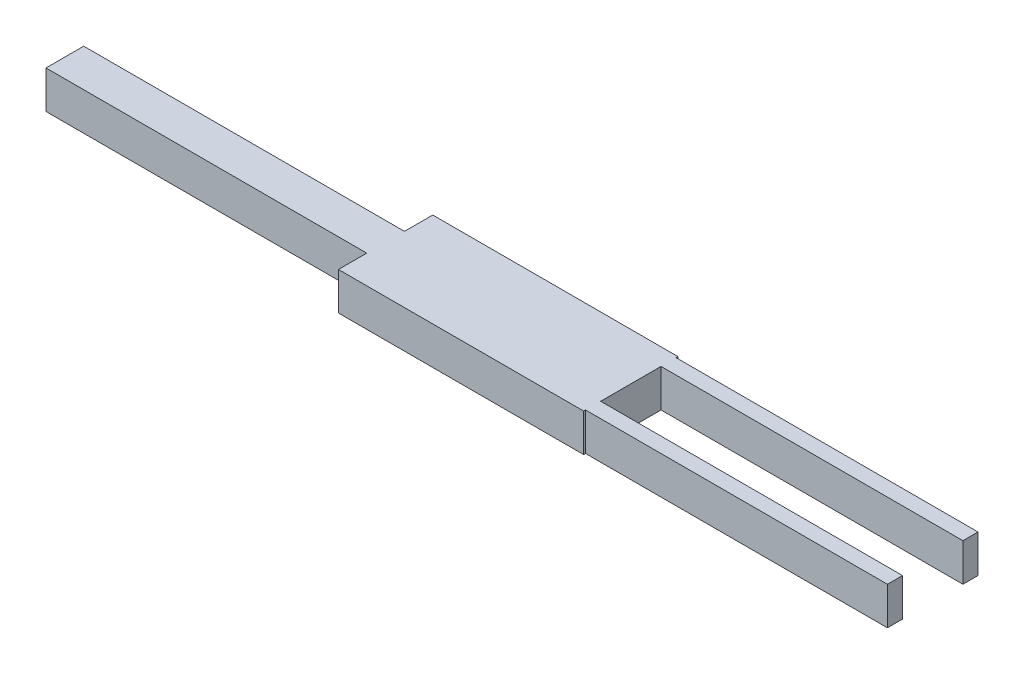
ISO-10303-21;
HEADER;
FILE_DESCRIPTION(('STEP AP214'),'2;1');
FILE_NAME('part.step','',(''),(''),'','','');
FILE_SCHEMA(('AUTOMOTIVE_DESIGN { 1 0 10303 214 1 1 1 1 }'));
ENDSEC;
DATA;
#1=APPLICATION_CONTEXT('core data for automotive mechanical design processes');
#2=APPLICATION_PROTOCOL_DEFINITION('international standard','automotive_design',2000,#1);
#3=PRODUCT_CONTEXT('',#1,'mechanical');
#4=PRODUCT('Part','Part','',(#3));
#5=PRODUCT_RELATED_PRODUCT_CATEGORY('part','',(#4));
#6=PRODUCT_DEFINITION_FORMATION('','',#4);
#7=PRODUCT_DEFINITION_CONTEXT('part definition',#1,'design');
#8=PRODUCT_DEFINITION('design','',#6,#7);
#9=PRODUCT_DEFINITION_SHAPE('','',#8);
#10=(LENGTH_UNIT() NAMED_UNIT(*) SI_UNIT(.MILLI.,.METRE.));
#11=(NAMED_UNIT(*) PLANE_ANGLE_UNIT() SI_UNIT($,.RADIAN.));
#12=(NAMED_UNIT(*) SI_UNIT($,.STERADIAN.) SOLID_ANGLE_UNIT());
#13=UNCERTAINTY_MEASURE_WITH_UNIT(LENGTH_MEASURE(1.E-05),#10,'distance_accuracy_value','');
#14=(GEOMETRIC_REPRESENTATION_CONTEXT(3) GLOBAL_UNCERTAINTY_ASSIGNED_CONTEXT((#13)) GLOBAL_UNIT_ASSIGNED_CONTEXT((#10,
#11,#12)) REPRESENTATION_CONTEXT('',''));
#15=CARTESIAN_POINT('',(0.,0.,0.));
#16=DIRECTION('',(0.,0.,1.));
#17=DIRECTION('',(1.,0.,0.));
#18=AXIS2_PLACEMENT_3D('',#15,#16,#17);
#19=CARTESIAN_POINT('',(251.197875897678,10.,-10.1864142560755));
#20=DIRECTION('',(-1.,0.,0.));
#21=DIRECTION('',(0.,0.,1.));
#22=AXIS2_PLACEMENT_3D('',#19,#20,#21);
#23=PLANE('',#22);
#24=DIRECTION('',(0.,0.,-1.));
#25=VECTOR('',#24,1.);
#26=CARTESIAN_POINT('',(251.197875897678,0.,-10.1864142560755));
#27=LINE('',#26,#25);
#28=CARTESIAN_POINT('',(251.197875897678,0.,-10.1864142560755));
#29=VERTEX_POINT('',#28);
#30=CARTESIAN_POINT('',(251.197875897678,0.,-14.1864142560755));
#31=VERTEX_POINT('',#30);
#32=EDGE_CURVE('E177',#29,#31,#27,.T.);
#33=ORIENTED_EDGE('',*,*,#32,.T.);
#34=DIRECTION('',(0.,-1.,0.));
#35=VECTOR('',#34,1.);
#36=CARTESIAN_POINT('',(251.197875897678,10.,-14.1864142560755));
#37=LINE('',#36,#35);
#38=CARTESIAN_POINT('',(251.197875897678,10.,-14.1864142560755));
#39=VERTEX_POINT('',#38);
#40=EDGE_CURVE('E11',#39,#31,#37,.T.);
#41=ORIENTED_EDGE('',*,*,#40,.F.);
#42=DIRECTION('',(0.,0.,-1.));
#43=VECTOR('',#42,1.);
#44=CARTESIAN_POINT('',(251.197875897678,10.,-10.1864142560755));
#45=LINE('',#44,#43);
#46=CARTESIAN_POINT('',(251.197875897678,10.,-10.1864142560755));
#47=VERTEX_POINT('',#46);
#48=EDGE_CURVE('E207',#47,#39,#45,.T.);
#49=ORIENTED_EDGE('',*,*,#48,.F.);
#50=DIRECTION('',(0.,-1.,0.));
#51=VECTOR('',#50,1.);
#52=CARTESIAN_POINT('',(251.197875897678,10.,-10.1864142560755));
#53=LINE('',#52,#51);
#54=EDGE_CURVE('E173',#47,#29,#53,.T.);
#55=ORIENTED_EDGE('',*,*,#54,.T.);
#56=EDGE_LOOP('',(#33,#41,#49,#55));
#57=FACE_BOUND('',#56,.T.);
#58=ADVANCED_FACE('F33',(#57),#23,.F.);
#59=CARTESIAN_POINT('',(251.197875897678,10.,-14.1864142560755));
#60=DIRECTION('',(0.,0.,1.));
#61=DIRECTION('',(1.,0.,0.));
#62=AXIS2_PLACEMENT_3D('',#59,#60,#61);
#63=PLANE('',#62);
#64=DIRECTION('',(-1.,0.,0.));
#65=VECTOR('',#64,1.);
#66=CARTESIAN_POINT('',(251.197875897678,0.,-14.1864142560755));
#67=LINE('',#66,#65);
#68=CARTESIAN_POINT('',(171.197875897678,0.,-14.1864142560755));
#69=VERTEX_POINT('',#68);
#70=EDGE_CURVE('E180',#31,#69,#67,.T.);
#71=ORIENTED_EDGE('',*,*,#70,.T.);
#72=DIRECTION('',(0.,-1.,0.));
#73=VECTOR('',#72,1.);
#74=CARTESIAN_POINT('',(171.197875897678,10.,-14.1864142560755));
#75=LINE('',#74,#73);
#76=CARTESIAN_POINT('',(171.197875897678,10.,-14.1864142560755));
#77=VERTEX_POINT('',#76);
#78=EDGE_CURVE('E41',#77,#69,#75,.T.);
#79=ORIENTED_EDGE('',*,*,#78,.F.);
#80=DIRECTION('',(-1.,0.,0.));
#81=VECTOR('',#80,1.);
#82=CARTESIAN_POINT('',(251.197875897678,10.,-14.1864142560755));
#83=LINE('',#82,#81);
#84=EDGE_CURVE('E116',#39,#77,#83,.T.);
#85=ORIENTED_EDGE('',*,*,#84,.F.);
#86=ORIENTED_EDGE('',*,*,#40,.T.);
#87=EDGE_LOOP('',(#71,#79,#85,#86));
#88=FACE_BOUND('',#87,.T.);
#89=ADVANCED_FACE('F305',(#88),#63,.F.);
#90=CARTESIAN_POINT('',(171.197875897678,10.,-14.1864142560755));
#91=DIRECTION('',(-1.,0.,0.));
#92=DIRECTION('',(0.,0.,1.));
#93=AXIS2_PLACEMENT_3D('',#90,#91,#92);
#94=PLANE('',#93);
#95=DIRECTION('',(0.,0.,-1.));
#96=VECTOR('',#95,1.);
#97=CARTESIAN_POINT('',(171.197875897678,0.,-14.1864142560755));
#98=LINE('',#97,#96);
#99=CARTESIAN_POINT('',(171.197875897678,0.,-14.6864142560755));
#100=VERTEX_POINT('',#99);
#101=EDGE_CURVE('E182',#69,#100,#98,.T.);
#102=ORIENTED_EDGE('',*,*,#101,.T.);
#103=DIRECTION('',(0.,-1.,0.));
#104=VECTOR('',#103,1.);
#105=CARTESIAN_POINT('',(171.197875897678,10.,-14.6864142560755));
#106=LINE('',#105,#104);
#107=CARTESIAN_POINT('',(171.197875897678,10.,-14.6864142560755));
#108=VERTEX_POINT('',#107);
#109=EDGE_CURVE('E238',#108,#100,#106,.T.);
#110=ORIENTED_EDGE('',*,*,#109,.F.);
#111=DIRECTION('',(0.,0.,-1.));
#112=VECTOR('',#111,1.);
#113=CARTESIAN_POINT('',(171.197875897678,10.,-14.1864142560755));
#114=LINE('',#113,#112);
#115=EDGE_CURVE('E246',#77,#108,#114,.T.);
#116=ORIENTED_EDGE('',*,*,#115,.F.);
#117=ORIENTED_EDGE('',*,*,#78,.T.);
#118=EDGE_LOOP('',(#102,#110,#116,#117));
#119=FACE_BOUND('',#118,.T.);
#120=ADVANCED_FACE('F244',(#119),#94,.F.);
#121=CARTESIAN_POINT('',(171.197875897678,10.,-14.6864142560755));
#122=DIRECTION('',(0.,0.,1.));
#123=DIRECTION('',(1.,0.,0.));
#124=AXIS2_PLACEMENT_3D('',#121,#122,#123);
#125=PLANE('',#124);
#126=DIRECTION('',(-1.,0.,0.));
#127=VECTOR('',#126,1.);
#128=CARTESIAN_POINT('',(171.197875897678,0.,-14.6864142560755));
#129=LINE('',#128,#127);
#130=CARTESIAN_POINT('',(106.197875897678,0.,-14.6864142560755));
#131=VERTEX_POINT('',#130);
#132=EDGE_CURVE('E184',#100,#131,#129,.T.);
#133=ORIENTED_EDGE('',*,*,#132,.T.);
#134=DIRECTION('',(0.,-1.,0.));
#135=VECTOR('',#134,1.);
#136=CARTESIAN_POINT('',(106.197875897678,10.,-14.6864142560755));
#137=LINE('',#136,#135);
#138=CARTESIAN_POINT('',(106.197875897678,10.,-14.6864142560755));
#139=VERTEX_POINT('',#138);
#140=EDGE_CURVE('E235',#139,#131,#137,.T.);
#141=ORIENTED_EDGE('',*,*,#140,.F.);
#142=DIRECTION('',(-1.,0.,0.));
#143=VECTOR('',#142,1.);
#144=CARTESIAN_POINT('',(171.197875897678,10.,-14.6864142560755));
#145=LINE('',#144,#143);
#146=EDGE_CURVE('E264',#108,#139,#145,.T.);
#147=ORIENTED_EDGE('',*,*,#146,.F.);
#148=ORIENTED_EDGE('',*,*,#109,.T.);
#149=EDGE_LOOP('',(#133,#141,#147,#148));
#150=FACE_BOUND('',#149,.T.);
#151=ADVANCED_FACE('F255',(#150),#125,.F.);
#152=CARTESIAN_POINT('',(106.197875897678,10.,-14.6864142560755));
#153=DIRECTION('',(1.,0.,0.));
#154=DIRECTION('',(0.,0.,-1.));
#155=AXIS2_PLACEMENT_3D('',#152,#153,#154);
#156=PLANE('',#155);
#157=DIRECTION('',(0.,0.,1.));
#158=VECTOR('',#157,1.);
#159=CARTESIAN_POINT('',(106.197875897678,0.,-14.6864142560755));
#160=LINE('',#159,#158);
#161=CARTESIAN_POINT('',(106.197875897678,0.,-7.18641425607552));
#162=VERTEX_POINT('',#161);
#163=EDGE_CURVE('E186',#131,#162,#160,.T.);
#164=ORIENTED_EDGE('',*,*,#163,.T.);
#165=DIRECTION('',(0.,-1.,0.));
#166=VECTOR('',#165,1.);
#167=CARTESIAN_POINT('',(106.197875897678,10.,-7.18641425607552));
#168=LINE('',#167,#166);
#169=CARTESIAN_POINT('',(106.197875897678,10.,-7.18641425607552));
#170=VERTEX_POINT('',#169);
#171=EDGE_CURVE('E232',#170,#162,#168,.T.);
#172=ORIENTED_EDGE('',*,*,#171,.F.);
#173=DIRECTION('',(0.,0.,1.));
#174=VECTOR('',#173,1.);
#175=CARTESIAN_POINT('',(106.197875897678,10.,-14.6864142560755));
#176=LINE('',#175,#174);
#177=EDGE_CURVE('E261',#139,#170,#176,.T.);
#178=ORIENTED_EDGE('',*,*,#177,.F.);
#179=ORIENTED_EDGE('',*,*,#140,.T.);
#180=EDGE_LOOP('',(#164,#172,#178,#179));
#181=FACE_BOUND('',#180,.T.);
#182=ADVANCED_FACE('F259',(#181),#156,.F.);
#183=CARTESIAN_POINT('',(106.197875897678,10.,-7.18641425607552));
#184=DIRECTION('',(0.,0.,1.));
#185=DIRECTION('',(1.,0.,0.));
#186=AXIS2_PLACEMENT_3D('',#183,#184,#185);
#187=PLANE('',#186);
#188=DIRECTION('',(-1.,0.,0.));
#189=VECTOR('',#188,1.);
#190=CARTESIAN_POINT('',(106.197875897678,0.,-7.18641425607552));
#191=LINE('',#190,#189);
#192=CARTESIAN_POINT('',(21.1978758976784,0.,-7.1864142560755));
#193=VERTEX_POINT('',#192);
#194=EDGE_CURVE('E188',#162,#193,#191,.T.);
#195=ORIENTED_EDGE('',*,*,#194,.T.);
#196=DIRECTION('',(0.,-1.,0.));
#197=VECTOR('',#196,1.);
#198=CARTESIAN_POINT('',(21.1978758976784,10.,-7.1864142560755));
#199=LINE('',#198,#197);
#200=CARTESIAN_POINT('',(21.1978758976784,10.,-7.1864142560755));
#201=VERTEX_POINT('',#200);
#202=EDGE_CURVE('E229',#201,#193,#199,.T.);
#203=ORIENTED_EDGE('',*,*,#202,.F.);
#204=DIRECTION('',(-1.,0.,0.));
#205=VECTOR('',#204,1.);
#206=CARTESIAN_POINT('',(106.197875897678,10.,-7.18641425607552));
#207=LINE('',#206,#205);
#208=EDGE_CURVE('E263',#170,#201,#207,.T.);
#209=ORIENTED_EDGE('',*,*,#208,.F.);
#210=ORIENTED_EDGE('',*,*,#171,.T.);
#211=EDGE_LOOP('',(#195,#203,#209,#210));
#212=FACE_BOUND('',#211,.T.);
#213=ADVANCED_FACE('F318',(#212),#187,.F.);
#214=CARTESIAN_POINT('',(21.1978758976784,10.,-7.1864142560755));
#215=DIRECTION('',(1.,0.,0.));
#216=DIRECTION('',(0.,0.,-1.));
#217=AXIS2_PLACEMENT_3D('',#214,#215,#216);
#218=PLANE('',#217);
#219=DIRECTION('',(0.,0.,1.));
#220=VECTOR('',#219,1.);
#221=CARTESIAN_POINT('',(21.1978758976784,0.,-7.1864142560755));
#222=LINE('',#221,#220);
#223=CARTESIAN_POINT('',(21.1978758976784,0.,2.81358574392446));
#224=VERTEX_POINT('',#223);
#225=EDGE_CURVE('E190',#193,#224,#222,.T.);
#226=ORIENTED_EDGE('',*,*,#225,.T.);
#227=DIRECTION('',(0.,-1.,0.));
#228=VECTOR('',#227,1.);
#229=CARTESIAN_POINT('',(21.1978758976784,10.,2.81358574392446));
#230=LINE('',#229,#228);
#231=CARTESIAN_POINT('',(21.1978758976784,10.,2.81358574392446));
#232=VERTEX_POINT('',#231);
#233=EDGE_CURVE('E226',#232,#224,#230,.T.);
#234=ORIENTED_EDGE('',*,*,#233,.F.);
#235=DIRECTION('',(0.,0.,1.));
#236=VECTOR('',#235,1.);
#237=CARTESIAN_POINT('',(21.1978758976784,10.,-7.1864142560755));
#238=LINE('',#237,#236);
#239=EDGE_CURVE('E266',#201,#232,#238,.T.);
#240=ORIENTED_EDGE('',*,*,#239,.F.);
#241=ORIENTED_EDGE('',*,*,#202,.T.);
#242=EDGE_LOOP('',(#226,#234,#240,#241));
#243=FACE_BOUND('',#242,.T.);
#244=ADVANCED_FACE('F321',(#243),#218,.F.);
#245=CARTESIAN_POINT('',(21.1978758976784,10.,2.81358574392446));
#246=DIRECTION('',(0.,0.,-1.));
#247=DIRECTION('',(-1.,0.,0.));
#248=AXIS2_PLACEMENT_3D('',#245,#246,#247);
#249=PLANE('',#248);
#250=DIRECTION('',(1.,0.,0.));
#251=VECTOR('',#250,1.);
#252=CARTESIAN_POINT('',(21.1978758976784,0.,2.81358574392446));
#253=LINE('',#252,#251);
#254=CARTESIAN_POINT('',(106.197875897678,0.,2.81358574392445));
#255=VERTEX_POINT('',#254);
#256=EDGE_CURVE('E192',#224,#255,#253,.T.);
#257=ORIENTED_EDGE('',*,*,#256,.T.);
#258=DIRECTION('',(0.,-1.,0.));
#259=VECTOR('',#258,1.);
#260=CARTESIAN_POINT('',(106.197875897678,10.,2.81358574392445));
#261=LINE('',#260,#259);
#262=CARTESIAN_POINT('',(106.197875897678,10.,2.81358574392445));
#263=VERTEX_POINT('',#262);
#264=EDGE_CURVE('E223',#263,#255,#261,.T.);
#265=ORIENTED_EDGE('',*,*,#264,.F.);
#266=DIRECTION('',(1.,0.,0.));
#267=VECTOR('',#266,1.);
#268=CARTESIAN_POINT('',(21.1978758976784,10.,2.81358574392446));
#269=LINE('',#268,#267);
#270=EDGE_CURVE('E272',#232,#263,#269,.T.);
#271=ORIENTED_EDGE('',*,*,#270,.F.);
#272=ORIENTED_EDGE('',*,*,#233,.T.);
#273=EDGE_LOOP('',(#257,#265,#271,#272));
#274=FACE_BOUND('',#273,.T.);
#275=ADVANCED_FACE('F325',(#274),#249,.F.);
#276=CARTESIAN_POINT('',(106.197875897678,10.,2.81358574392445));
#277=DIRECTION('',(1.,0.,0.));
#278=DIRECTION('',(0.,0.,-1.));
#279=AXIS2_PLACEMENT_3D('',#276,#277,#278);
#280=PLANE('',#279);
#281=DIRECTION('',(0.,0.,1.));
#282=VECTOR('',#281,1.);
#283=CARTESIAN_POINT('',(106.197875897678,0.,2.81358574392445));
#284=LINE('',#283,#282);
#285=CARTESIAN_POINT('',(106.197875897678,0.,10.3135857439245));
#286=VERTEX_POINT('',#285);
#287=EDGE_CURVE('E194',#255,#286,#284,.T.);
#288=ORIENTED_EDGE('',*,*,#287,.T.);
#289=DIRECTION('',(0.,-1.,0.));
#290=VECTOR('',#289,1.);
#291=CARTESIAN_POINT('',(106.197875897678,10.,10.3135857439245));
#292=LINE('',#291,#290);
#293=CARTESIAN_POINT('',(106.197875897678,10.,10.3135857439245));
#294=VERTEX_POINT('',#293);
#295=EDGE_CURVE('E220',#294,#286,#292,.T.);
#296=ORIENTED_EDGE('',*,*,#295,.F.);
#297=DIRECTION('',(0.,0.,1.));
#298=VECTOR('',#297,1.);
#299=CARTESIAN_POINT('',(106.197875897678,10.,2.81358574392445));
#300=LINE('',#299,#298);
#301=EDGE_CURVE('E274',#263,#294,#300,.T.);
#302=ORIENTED_EDGE('',*,*,#301,.F.);
#303=ORIENTED_EDGE('',*,*,#264,.T.);
#304=EDGE_LOOP('',(#288,#296,#302,#303));
#305=FACE_BOUND('',#304,.T.);
#306=ADVANCED_FACE('F329',(#305),#280,.F.);
#307=CARTESIAN_POINT('',(106.197875897678,10.,10.3135857439245));
#308=DIRECTION('',(0.,0.,-1.));
#309=DIRECTION('',(-1.,0.,0.));
#310=AXIS2_PLACEMENT_3D('',#307,#308,#309);
#311=PLANE('',#310);
#312=DIRECTION('',(1.,0.,0.));
#313=VECTOR('',#312,1.);
#314=CARTESIAN_POINT('',(106.197875897678,0.,10.3135857439245));
#315=LINE('',#314,#313);
#316=CARTESIAN_POINT('',(171.197875897678,0.,10.3135857439245));
#317=VERTEX_POINT('',#316);
#318=EDGE_CURVE('E196',#286,#317,#315,.T.);
#319=ORIENTED_EDGE('',*,*,#318,.T.);
#320=DIRECTION('',(0.,-1.,0.));
#321=VECTOR('',#320,1.);
#322=CARTESIAN_POINT('',(171.197875897678,10.,10.3135857439245));
#323=LINE('',#322,#321);
#324=CARTESIAN_POINT('',(171.197875897678,10.,10.3135857439245));
#325=VERTEX_POINT('',#324);
#326=EDGE_CURVE('E217',#325,#317,#323,.T.);
#327=ORIENTED_EDGE('',*,*,#326,.F.);
#328=DIRECTION('',(1.,0.,0.));
#329=VECTOR('',#328,1.);
#330=CARTESIAN_POINT('',(106.197875897678,10.,10.3135857439245));
#331=LINE('',#330,#329);
#332=EDGE_CURVE('E276',#294,#325,#331,.T.);
#333=ORIENTED_EDGE('',*,*,#332,.F.);
#334=ORIENTED_EDGE('',*,*,#295,.T.);
#335=EDGE_LOOP('',(#319,#327,#333,#334));
#336=FACE_BOUND('',#335,.T.);
#337=ADVANCED_FACE('F333',(#336),#311,.F.);
#338=CARTESIAN_POINT('',(171.197875897678,10.,10.3135857439245));
#339=DIRECTION('',(-1.,0.,0.));
#340=DIRECTION('',(0.,0.,1.));
#341=AXIS2_PLACEMENT_3D('',#338,#339,#340);
#342=PLANE('',#341);
#343=DIRECTION('',(0.,0.,-1.));
#344=VECTOR('',#343,1.);
#345=CARTESIAN_POINT('',(171.197875897678,0.,10.3135857439245));
#346=LINE('',#345,#344);
#347=CARTESIAN_POINT('',(171.197875897678,0.,9.81358574392448));
#348=VERTEX_POINT('',#347);
#349=EDGE_CURVE('E198',#317,#348,#346,.T.);
#350=ORIENTED_EDGE('',*,*,#349,.T.);
#351=DIRECTION('',(0.,-1.,0.));
#352=VECTOR('',#351,1.);
#353=CARTESIAN_POINT('',(171.197875897678,10.,9.81358574392448));
#354=LINE('',#353,#352);
#355=CARTESIAN_POINT('',(171.197875897678,10.,9.81358574392448));
#356=VERTEX_POINT('',#355);
#357=EDGE_CURVE('E214',#356,#348,#354,.T.);
#358=ORIENTED_EDGE('',*,*,#357,.F.);
#359=DIRECTION('',(0.,0.,-1.));
#360=VECTOR('',#359,1.);
#361=CARTESIAN_POINT('',(171.197875897678,10.,10.3135857439245));
#362=LINE('',#361,#360);
#363=EDGE_CURVE('E278',#325,#356,#362,.T.);
#364=ORIENTED_EDGE('',*,*,#363,.F.);
#365=ORIENTED_EDGE('',*,*,#326,.T.);
#366=EDGE_LOOP('',(#350,#358,#364,#365));
#367=FACE_BOUND('',#366,.T.);
#368=ADVANCED_FACE('F337',(#367),#342,.F.);
#369=CARTESIAN_POINT('',(171.197875897678,10.,9.81358574392448));
#370=DIRECTION('',(0.,0.,-1.));
#371=DIRECTION('',(-1.,0.,0.));
#372=AXIS2_PLACEMENT_3D('',#369,#370,#371);
#373=PLANE('',#372);
#374=DIRECTION('',(1.,0.,0.));
#375=VECTOR('',#374,1.);
#376=CARTESIAN_POINT('',(171.197875897678,0.,9.81358574392448));
#377=LINE('',#376,#375);
#378=CARTESIAN_POINT('',(251.197875897678,0.,9.81358574392454));
#379=VERTEX_POINT('',#378);
#380=EDGE_CURVE('E200',#348,#379,#377,.T.);
#381=ORIENTED_EDGE('',*,*,#380,.T.);
#382=DIRECTION('',(0.,-1.,0.));
#383=VECTOR('',#382,1.);
#384=CARTESIAN_POINT('',(251.197875897678,10.,9.81358574392454));
#385=LINE('',#384,#383);
#386=CARTESIAN_POINT('',(251.197875897678,10.,9.81358574392454));
#387=VERTEX_POINT('',#386);
#388=EDGE_CURVE('E211',#387,#379,#385,.T.);
#389=ORIENTED_EDGE('',*,*,#388,.F.);
#390=DIRECTION('',(1.,0.,0.));
#391=VECTOR('',#390,1.);
#392=CARTESIAN_POINT('',(171.197875897678,10.,9.81358574392448));
#393=LINE('',#392,#391);
#394=EDGE_CURVE('E280',#356,#387,#393,.T.);
#395=ORIENTED_EDGE('',*,*,#394,.F.);
#396=ORIENTED_EDGE('',*,*,#357,.T.);
#397=EDGE_LOOP('',(#381,#389,#395,#396));
#398=FACE_BOUND('',#397,.T.);
#399=ADVANCED_FACE('F286',(#398),#373,.F.);
#400=CARTESIAN_POINT('',(251.197875897678,10.,9.81358574392454));
#401=DIRECTION('',(-1.,0.,0.));
#402=DIRECTION('',(0.,0.,1.));
#403=AXIS2_PLACEMENT_3D('',#400,#401,#402);
#404=PLANE('',#403);
#405=DIRECTION('',(0.,0.,-1.));
#406=VECTOR('',#405,1.);
#407=CARTESIAN_POINT('',(251.197875897678,0.,9.81358574392454));
#408=LINE('',#407,#406);
#409=CARTESIAN_POINT('',(251.197875897678,0.,5.81358574392454));
#410=VERTEX_POINT('',#409);
#411=EDGE_CURVE('E202',#379,#410,#408,.T.);
#412=ORIENTED_EDGE('',*,*,#411,.T.);
#413=DIRECTION('',(0.,-1.,0.));
#414=VECTOR('',#413,1.);
#415=CARTESIAN_POINT('',(251.197875897678,10.,5.81358574392454));
#416=LINE('',#415,#414);
#417=CARTESIAN_POINT('',(251.197875897678,10.,5.81358574392454));
#418=VERTEX_POINT('',#417);
#419=EDGE_CURVE('E168',#418,#410,#416,.T.);
#420=ORIENTED_EDGE('',*,*,#419,.F.);
#421=DIRECTION('',(0.,0.,-1.));
#422=VECTOR('',#421,1.);
#423=CARTESIAN_POINT('',(251.197875897678,10.,9.81358574392454));
#424=LINE('',#423,#422);
#425=EDGE_CURVE('E159',#387,#418,#424,.T.);
#426=ORIENTED_EDGE('',*,*,#425,.F.);
#427=ORIENTED_EDGE('',*,*,#388,.T.);
#428=EDGE_LOOP('',(#412,#420,#426,#427));
#429=FACE_BOUND('',#428,.T.);
#430=ADVANCED_FACE('F290',(#429),#404,.F.);
#431=CARTESIAN_POINT('',(171.197875897678,10.,5.81358574392454));
#432=DIRECTION('',(0.,0.,1.));
#433=DIRECTION('',(1.,0.,0.));
#434=AXIS2_PLACEMENT_3D('',#431,#432,#433);
#435=PLANE('',#434);
#436=DIRECTION('',(-1.,0.,0.));
#437=VECTOR('',#436,1.);
#438=CARTESIAN_POINT('',(171.197875897678,0.,5.81358574392454));
#439=LINE('',#438,#437);
#440=CARTESIAN_POINT('',(171.197875897678,0.,5.81358574392454));
#441=VERTEX_POINT('',#440);
#442=EDGE_CURVE('E167',#410,#441,#439,.T.);
#443=ORIENTED_EDGE('',*,*,#442,.T.);
#444=DIRECTION('',(0.,-1.,0.));
#445=VECTOR('',#444,1.);
#446=CARTESIAN_POINT('',(171.197875897678,10.,5.81358574392454));
#447=LINE('',#446,#445);
#448=CARTESIAN_POINT('',(171.197875897678,10.,5.81358574392454));
#449=VERTEX_POINT('',#448);
#450=EDGE_CURVE('E164',#449,#441,#447,.T.);
#451=ORIENTED_EDGE('',*,*,#450,.F.);
#452=DIRECTION('',(-1.,0.,0.));
#453=VECTOR('',#452,1.);
#454=CARTESIAN_POINT('',(171.197875897678,10.,5.81358574392454));
#455=LINE('',#454,#453);
#456=EDGE_CURVE('E153',#418,#449,#455,.T.);
#457=ORIENTED_EDGE('',*,*,#456,.F.);
#458=ORIENTED_EDGE('',*,*,#419,.T.);
#459=EDGE_LOOP('',(#443,#451,#457,#458));
#460=FACE_BOUND('',#459,.T.);
#461=ADVANCED_FACE('F165',(#460),#435,.F.);
#462=CARTESIAN_POINT('',(171.197875897678,10.,-10.1864142560755));
#463=DIRECTION('',(-1.,0.,0.));
#464=DIRECTION('',(0.,0.,1.));
#465=AXIS2_PLACEMENT_3D('',#462,#463,#464);
#466=PLANE('',#465);
#467=DIRECTION('',(0.,0.,-1.));
#468=VECTOR('',#467,1.);
#469=CARTESIAN_POINT('',(171.197875897678,0.,-10.1864142560755));
#470=LINE('',#469,#468);
#471=CARTESIAN_POINT('',(171.197875897678,0.,-10.1864142560755));
#472=VERTEX_POINT('',#471);
#473=EDGE_CURVE('E102',#441,#472,#470,.T.);
#474=ORIENTED_EDGE('',*,*,#473,.T.);
#475=DIRECTION('',(0.,-1.,0.));
#476=VECTOR('',#475,1.);
#477=CARTESIAN_POINT('',(171.197875897678,10.,-10.1864142560755));
#478=LINE('',#477,#476);
#479=CARTESIAN_POINT('',(171.197875897678,10.,-10.1864142560755));
#480=VERTEX_POINT('',#479);
#481=EDGE_CURVE('E169',#480,#472,#478,.T.);
#482=ORIENTED_EDGE('',*,*,#481,.F.);
#483=DIRECTION('',(0.,0.,-1.));
#484=VECTOR('',#483,1.);
#485=CARTESIAN_POINT('',(171.197875897678,10.,-10.1864142560755));
#486=LINE('',#485,#484);
#487=EDGE_CURVE('E157',#449,#480,#486,.T.);
#488=ORIENTED_EDGE('',*,*,#487,.F.);
#489=ORIENTED_EDGE('',*,*,#450,.T.);
#490=EDGE_LOOP('',(#474,#482,#488,#489));
#491=FACE_BOUND('',#490,.T.);
#492=ADVANCED_FACE('F171',(#491),#466,.F.);
#493=CARTESIAN_POINT('',(251.197875897678,10.,-10.1864142560755));
#494=DIRECTION('',(0.,0.,-1.));
#495=DIRECTION('',(-1.,0.,0.));
#496=AXIS2_PLACEMENT_3D('',#493,#494,#495);
#497=PLANE('',#496);
#498=DIRECTION('',(1.,0.,0.));
#499=VECTOR('',#498,1.);
#500=CARTESIAN_POINT('',(251.197875897678,0.,-10.1864142560755));
#501=LINE('',#500,#499);
#502=EDGE_CURVE('E108',#472,#29,#501,.T.);
#503=ORIENTED_EDGE('',*,*,#502,.T.);
#504=ORIENTED_EDGE('',*,*,#54,.F.);
#505=DIRECTION('',(1.,0.,0.));
#506=VECTOR('',#505,1.);
#507=CARTESIAN_POINT('',(251.197875897678,10.,-10.1864142560755));
#508=LINE('',#507,#506);
#509=EDGE_CURVE('E49',#480,#47,#508,.T.);
#510=ORIENTED_EDGE('',*,*,#509,.F.);
#511=ORIENTED_EDGE('',*,*,#481,.T.);
#512=EDGE_LOOP('',(#503,#504,#510,#511));
#513=FACE_BOUND('',#512,.T.);
#514=ADVANCED_FACE('F294',(#513),#497,.F.);
#515=CARTESIAN_POINT('',(0.,10.,0.));
#516=DIRECTION('',(0.,1.,0.));
#517=DIRECTION('',(0.,0.,1.));
#518=AXIS2_PLACEMENT_3D('',#515,#516,#517);
#519=PLANE('',#518);
#520=ORIENTED_EDGE('',*,*,#48,.T.);
#521=ORIENTED_EDGE('',*,*,#84,.T.);
#522=ORIENTED_EDGE('',*,*,#115,.T.);
#523=ORIENTED_EDGE('',*,*,#146,.T.);
#524=ORIENTED_EDGE('',*,*,#177,.T.);
#525=ORIENTED_EDGE('',*,*,#208,.T.);
#526=ORIENTED_EDGE('',*,*,#239,.T.);
#527=ORIENTED_EDGE('',*,*,#270,.T.);
#528=ORIENTED_EDGE('',*,*,#301,.T.);
#529=ORIENTED_EDGE('',*,*,#332,.T.);
#530=ORIENTED_EDGE('',*,*,#363,.T.);
#531=ORIENTED_EDGE('',*,*,#394,.T.);
#532=ORIENTED_EDGE('',*,*,#425,.T.);
#533=ORIENTED_EDGE('',*,*,#456,.T.);
#534=ORIENTED_EDGE('',*,*,#487,.T.);
#535=ORIENTED_EDGE('',*,*,#509,.T.);
#536=EDGE_LOOP('',(#520,#521,#522,#523,#524,#525,#526,#527,#528,#529,#530,#531,#532,#533,#534,#535));
#537=FACE_BOUND('',#536,.T.);
#538=ADVANCED_FACE('F155',(#537),#519,.T.);
#539=CARTESIAN_POINT('',(0.,0.,0.));
#540=DIRECTION('',(0.,1.,0.));
#541=DIRECTION('',(0.,0.,1.));
#542=AXIS2_PLACEMENT_3D('',#539,#540,#541);
#543=PLANE('',#542);
#544=ORIENTED_EDGE('',*,*,#32,.F.);
#545=ORIENTED_EDGE('',*,*,#502,.F.);
#546=ORIENTED_EDGE('',*,*,#473,.F.);
#547=ORIENTED_EDGE('',*,*,#442,.F.);
#548=ORIENTED_EDGE('',*,*,#411,.F.);
#549=ORIENTED_EDGE('',*,*,#380,.F.);
#550=ORIENTED_EDGE('',*,*,#349,.F.);
#551=ORIENTED_EDGE('',*,*,#318,.F.);
#552=ORIENTED_EDGE('',*,*,#287,.F.);
#553=ORIENTED_EDGE('',*,*,#256,.F.);
#554=ORIENTED_EDGE('',*,*,#225,.F.);
#555=ORIENTED_EDGE('',*,*,#194,.F.);
#556=ORIENTED_EDGE('',*,*,#163,.F.);
#557=ORIENTED_EDGE('',*,*,#132,.F.);
#558=ORIENTED_EDGE('',*,*,#101,.F.);
#559=ORIENTED_EDGE('',*,*,#70,.F.);
#560=EDGE_LOOP('',(#544,#545,#546,#547,#548,#549,#550,#551,#552,#553,#554,#555,#556,#557,#558,#559));
#561=FACE_BOUND('',#560,.T.);
#562=ADVANCED_FACE('F250',(#561),#543,.F.);
#563=CLOSED_SHELL('',(#58,#89,#120,#151,#182,#213,#244,#275,#306,#337,#368,#399,#430,#461,#492,
#514,#538,#562));
#564=MANIFOLD_SOLID_BREP('B2',#563);
#565=ADVANCED_BREP_SHAPE_REPRESENTATION('',(#18,#564),#14);
#566=SHAPE_DEFINITION_REPRESENTATION(#9,#565);
ENDSEC;
END-ISO-10303-21;
